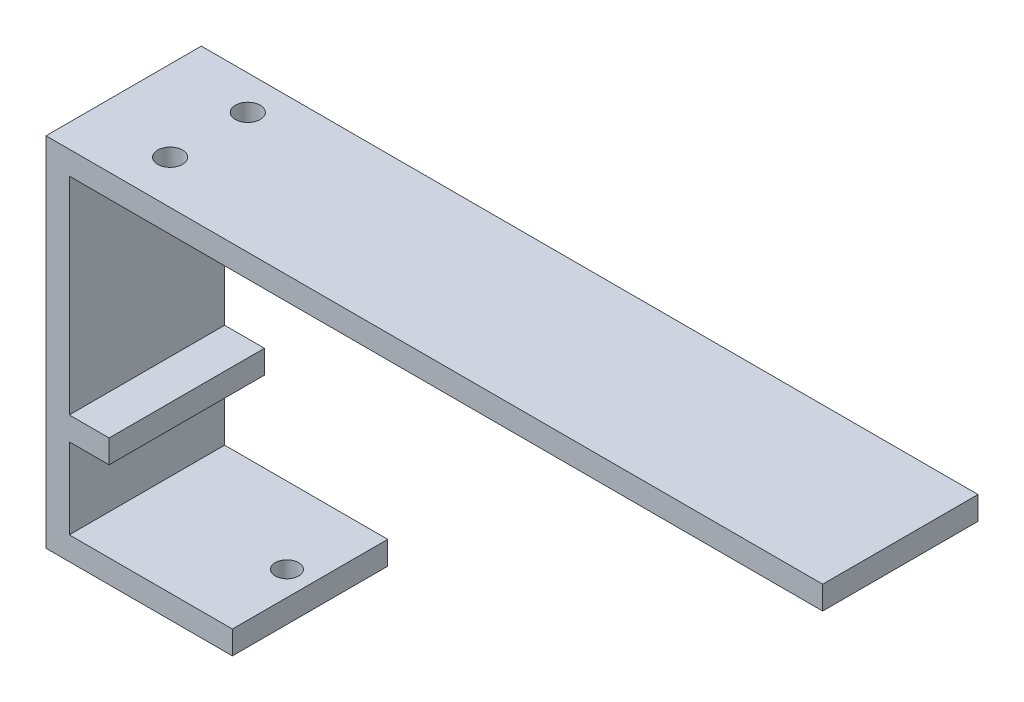
ISO-10303-21;
HEADER;
FILE_DESCRIPTION(('STEP AP214'),'2;1');
FILE_NAME('part.step','',(''),(''),'','','');
FILE_SCHEMA(('AUTOMOTIVE_DESIGN { 1 0 10303 214 1 1 1 1 }'));
ENDSEC;
DATA;
#1=APPLICATION_CONTEXT('core data for automotive mechanical design processes');
#2=APPLICATION_PROTOCOL_DEFINITION('international standard','automotive_design',2000,#1);
#3=PRODUCT_CONTEXT('',#1,'mechanical');
#4=PRODUCT('Part','Part','',(#3));
#5=PRODUCT_RELATED_PRODUCT_CATEGORY('part','',(#4));
#6=PRODUCT_DEFINITION_FORMATION('','',#4);
#7=PRODUCT_DEFINITION_CONTEXT('part definition',#1,'design');
#8=PRODUCT_DEFINITION('design','',#6,#7);
#9=PRODUCT_DEFINITION_SHAPE('','',#8);
#10=(LENGTH_UNIT() NAMED_UNIT(*) SI_UNIT(.MILLI.,.METRE.));
#11=(NAMED_UNIT(*) PLANE_ANGLE_UNIT() SI_UNIT($,.RADIAN.));
#12=(NAMED_UNIT(*) SI_UNIT($,.STERADIAN.) SOLID_ANGLE_UNIT());
#13=UNCERTAINTY_MEASURE_WITH_UNIT(LENGTH_MEASURE(1.E-05),#10,'distance_accuracy_value','');
#14=(GEOMETRIC_REPRESENTATION_CONTEXT(3) GLOBAL_UNCERTAINTY_ASSIGNED_CONTEXT((#13)) GLOBAL_UNIT_ASSIGNED_CONTEXT((#10,
#11,#12)) REPRESENTATION_CONTEXT('',''));
#15=CARTESIAN_POINT('',(0.,0.,0.));
#16=DIRECTION('',(0.,0.,1.));
#17=DIRECTION('',(1.,0.,0.));
#18=AXIS2_PLACEMENT_3D('',#15,#16,#17);
#19=CARTESIAN_POINT('',(3.,0.,0.));
#20=DIRECTION('',(1.,0.,0.));
#21=DIRECTION('',(0.,1.,0.));
#22=AXIS2_PLACEMENT_3D('',#19,#20,#21);
#23=PLANE('',#22);
#24=DIRECTION('',(0.,0.,1.));
#25=VECTOR('',#24,1.);
#26=CARTESIAN_POINT('',(3.,-26.63,0.));
#27=LINE('',#26,#25);
#28=CARTESIAN_POINT('',(3.,-26.63,-20.));
#29=VERTEX_POINT('',#28);
#30=CARTESIAN_POINT('',(3.,-26.63,0.));
#31=VERTEX_POINT('',#30);
#32=EDGE_CURVE('E11',#29,#31,#27,.T.);
#33=ORIENTED_EDGE('',*,*,#32,.F.);
#34=DIRECTION('',(0.,-1.,0.));
#35=VECTOR('',#34,1.);
#36=CARTESIAN_POINT('',(3.,0.,-20.));
#37=LINE('',#36,#35);
#38=CARTESIAN_POINT('',(3.,0.,-20.));
#39=VERTEX_POINT('',#38);
#40=EDGE_CURVE('E182',#39,#29,#37,.T.);
#41=ORIENTED_EDGE('',*,*,#40,.F.);
#42=DIRECTION('',(0.,0.,-1.));
#43=VECTOR('',#42,1.);
#44=CARTESIAN_POINT('',(3.,0.,0.));
#45=LINE('',#44,#43);
#46=CARTESIAN_POINT('',(3.,0.,0.));
#47=VERTEX_POINT('',#46);
#48=EDGE_CURVE('E181',#47,#39,#45,.T.);
#49=ORIENTED_EDGE('',*,*,#48,.F.);
#50=DIRECTION('',(0.,-1.,0.));
#51=VECTOR('',#50,1.);
#52=CARTESIAN_POINT('',(3.,0.,0.));
#53=LINE('',#52,#51);
#54=EDGE_CURVE('E53',#47,#31,#53,.T.);
#55=ORIENTED_EDGE('',*,*,#54,.T.);
#56=EDGE_LOOP('',(#33,#41,#49,#55));
#57=FACE_BOUND('',#56,.T.);
#58=ADVANCED_FACE('F37',(#57),#23,.T.);
#59=CARTESIAN_POINT('',(0.,0.,0.));
#60=DIRECTION('',(0.,-1.,0.));
#61=DIRECTION('',(0.,0.,-1.));
#62=AXIS2_PLACEMENT_3D('',#59,#60,#61);
#63=PLANE('',#62);
#64=CARTESIAN_POINT('',(10.38,0.,-5.6));
#65=DIRECTION('',(0.,-1.,0.));
#66=DIRECTION('',(0.,0.,-1.));
#67=AXIS2_PLACEMENT_3D('',#64,#65,#66);
#68=CIRCLE('',#67,1.6);
#69=CARTESIAN_POINT('',(10.38,0.,-7.2));
#70=VERTEX_POINT('',#69);
#71=EDGE_CURVE('E156',#70,#70,#68,.T.);
#72=ORIENTED_EDGE('',*,*,#71,.F.);
#73=EDGE_LOOP('',(#72));
#74=FACE_BOUND('',#73,.T.);
#75=CARTESIAN_POINT('',(10.38,0.,-15.6));
#76=DIRECTION('',(0.,-1.,0.));
#77=DIRECTION('',(0.,0.,-1.));
#78=AXIS2_PLACEMENT_3D('',#75,#76,#77);
#79=CIRCLE('',#78,1.6);
#80=CARTESIAN_POINT('',(10.38,0.,-17.2));
#81=VERTEX_POINT('',#80);
#82=EDGE_CURVE('E319',#81,#81,#79,.T.);
#83=ORIENTED_EDGE('',*,*,#82,.F.);
#84=EDGE_LOOP('',(#83));
#85=FACE_BOUND('',#84,.T.);
#86=DIRECTION('',(1.,0.,0.));
#87=VECTOR('',#86,1.);
#88=CARTESIAN_POINT('',(0.,0.,0.));
#89=LINE('',#88,#87);
#90=CARTESIAN_POINT('',(100.,0.,0.));
#91=VERTEX_POINT('',#90);
#92=EDGE_CURVE('E189',#47,#91,#89,.T.);
#93=ORIENTED_EDGE('',*,*,#92,.F.);
#94=ORIENTED_EDGE('',*,*,#48,.T.);
#95=DIRECTION('',(-1.,0.,0.));
#96=VECTOR('',#95,1.);
#97=CARTESIAN_POINT('',(0.,0.,-20.));
#98=LINE('',#97,#96);
#99=CARTESIAN_POINT('',(100.,0.,-20.));
#100=VERTEX_POINT('',#99);
#101=EDGE_CURVE('E196',#100,#39,#98,.T.);
#102=ORIENTED_EDGE('',*,*,#101,.F.);
#103=DIRECTION('',(0.,0.,-1.));
#104=VECTOR('',#103,1.);
#105=CARTESIAN_POINT('',(100.,0.,0.));
#106=LINE('',#105,#104);
#107=EDGE_CURVE('E204',#91,#100,#106,.T.);
#108=ORIENTED_EDGE('',*,*,#107,.F.);
#109=EDGE_LOOP('',(#93,#94,#102,#108));
#110=FACE_BOUND('',#109,.T.);
#111=ADVANCED_FACE('F252',(#74,#85,#110),#63,.T.);
#112=CARTESIAN_POINT('',(0.,3.,0.));
#113=DIRECTION('',(1.,0.,0.));
#114=DIRECTION('',(0.,0.,-1.));
#115=AXIS2_PLACEMENT_3D('',#112,#113,#114);
#116=PLANE('',#115);
#117=DIRECTION('',(0.,-1.,0.));
#118=VECTOR('',#117,1.);
#119=CARTESIAN_POINT('',(0.,3.,-20.));
#120=LINE('',#119,#118);
#121=CARTESIAN_POINT('',(0.,3.,-20.));
#122=VERTEX_POINT('',#121);
#123=CARTESIAN_POINT('',(0.,-43.,-20.));
#124=VERTEX_POINT('',#123);
#125=EDGE_CURVE('E202',#122,#124,#120,.T.);
#126=ORIENTED_EDGE('',*,*,#125,.T.);
#127=DIRECTION('',(0.,0.,-1.));
#128=VECTOR('',#127,1.);
#129=CARTESIAN_POINT('',(0.,-43.,0.));
#130=LINE('',#129,#128);
#131=CARTESIAN_POINT('',(0.,-43.,0.));
#132=VERTEX_POINT('',#131);
#133=EDGE_CURVE('E186',#132,#124,#130,.T.);
#134=ORIENTED_EDGE('',*,*,#133,.F.);
#135=DIRECTION('',(0.,-1.,0.));
#136=VECTOR('',#135,1.);
#137=CARTESIAN_POINT('',(0.,3.,0.));
#138=LINE('',#137,#136);
#139=CARTESIAN_POINT('',(0.,3.,0.));
#140=VERTEX_POINT('',#139);
#141=EDGE_CURVE('E215',#140,#132,#138,.T.);
#142=ORIENTED_EDGE('',*,*,#141,.F.);
#143=DIRECTION('',(0.,0.,1.));
#144=VECTOR('',#143,1.);
#145=CARTESIAN_POINT('',(0.,3.,0.));
#146=LINE('',#145,#144);
#147=EDGE_CURVE('E192',#122,#140,#146,.T.);
#148=ORIENTED_EDGE('',*,*,#147,.F.);
#149=EDGE_LOOP('',(#126,#134,#142,#148));
#150=FACE_BOUND('',#149,.T.);
#151=ADVANCED_FACE('F39',(#150),#116,.F.);
#152=CARTESIAN_POINT('',(0.,3.,0.));
#153=DIRECTION('',(0.,0.,-1.));
#154=DIRECTION('',(-1.,0.,0.));
#155=AXIS2_PLACEMENT_3D('',#152,#153,#154);
#156=PLANE('',#155);
#157=DIRECTION('',(-1.,0.,0.));
#158=VECTOR('',#157,1.);
#159=CARTESIAN_POINT('',(2.12653360182458,-26.63,0.));
#160=LINE('',#159,#158);
#161=CARTESIAN_POINT('',(8.12653360182458,-26.63,0.));
#162=VERTEX_POINT('',#161);
#163=EDGE_CURVE('E136',#162,#31,#160,.T.);
#164=ORIENTED_EDGE('',*,*,#163,.T.);
#165=ORIENTED_EDGE('',*,*,#54,.F.);
#166=ORIENTED_EDGE('',*,*,#92,.T.);
#167=DIRECTION('',(0.,-1.,0.));
#168=VECTOR('',#167,1.);
#169=CARTESIAN_POINT('',(100.,3.,0.));
#170=LINE('',#169,#168);
#171=CARTESIAN_POINT('',(100.,3.,0.));
#172=VERTEX_POINT('',#171);
#173=EDGE_CURVE('E212',#172,#91,#170,.T.);
#174=ORIENTED_EDGE('',*,*,#173,.F.);
#175=DIRECTION('',(1.,0.,0.));
#176=VECTOR('',#175,1.);
#177=CARTESIAN_POINT('',(0.,3.,0.));
#178=LINE('',#177,#176);
#179=EDGE_CURVE('E195',#140,#172,#178,.T.);
#180=ORIENTED_EDGE('',*,*,#179,.F.);
#181=ORIENTED_EDGE('',*,*,#141,.T.);
#182=DIRECTION('',(1.,0.,0.));
#183=VECTOR('',#182,1.);
#184=CARTESIAN_POINT('',(0.,-43.,0.));
#185=LINE('',#184,#183);
#186=CARTESIAN_POINT('',(24.,-43.,0.));
#187=VERTEX_POINT('',#186);
#188=EDGE_CURVE('E178',#132,#187,#185,.T.);
#189=ORIENTED_EDGE('',*,*,#188,.T.);
#190=DIRECTION('',(0.,-1.,0.));
#191=VECTOR('',#190,1.);
#192=CARTESIAN_POINT('',(24.,-40.,0.));
#193=LINE('',#192,#191);
#194=CARTESIAN_POINT('',(24.,-40.,0.));
#195=VERTEX_POINT('',#194);
#196=EDGE_CURVE('E162',#195,#187,#193,.T.);
#197=ORIENTED_EDGE('',*,*,#196,.F.);
#198=DIRECTION('',(1.,0.,0.));
#199=VECTOR('',#198,1.);
#200=CARTESIAN_POINT('',(24.,-40.,0.));
#201=LINE('',#200,#199);
#202=CARTESIAN_POINT('',(3.,-40.,0.));
#203=VERTEX_POINT('',#202);
#204=EDGE_CURVE('E165',#203,#195,#201,.T.);
#205=ORIENTED_EDGE('',*,*,#204,.F.);
#206=CARTESIAN_POINT('',(3.,-29.63,0.));
#207=VERTEX_POINT('',#206);
#208=EDGE_CURVE('E179',#207,#203,#53,.T.);
#209=ORIENTED_EDGE('',*,*,#208,.F.);
#210=DIRECTION('',(1.,0.,0.));
#211=VECTOR('',#210,1.);
#212=CARTESIAN_POINT('',(2.12653360182458,-29.63,0.));
#213=LINE('',#212,#211);
#214=CARTESIAN_POINT('',(8.12653360182458,-29.63,0.));
#215=VERTEX_POINT('',#214);
#216=EDGE_CURVE('E154',#207,#215,#213,.T.);
#217=ORIENTED_EDGE('',*,*,#216,.T.);
#218=DIRECTION('',(0.,1.,0.));
#219=VECTOR('',#218,1.);
#220=CARTESIAN_POINT('',(8.12653360182458,-29.63,0.));
#221=LINE('',#220,#219);
#222=EDGE_CURVE('E143',#215,#162,#221,.T.);
#223=ORIENTED_EDGE('',*,*,#222,.T.);
#224=EDGE_LOOP('',(#164,#165,#166,#174,#180,#181,#189,#197,#205,#209,#217,#223));
#225=FACE_BOUND('',#224,.T.);
#226=ADVANCED_FACE('F227',(#225),#156,.F.);
#227=CARTESIAN_POINT('',(100.,3.,0.));
#228=DIRECTION('',(-1.,0.,0.));
#229=DIRECTION('',(0.,0.,1.));
#230=AXIS2_PLACEMENT_3D('',#227,#228,#229);
#231=PLANE('',#230);
#232=ORIENTED_EDGE('',*,*,#107,.T.);
#233=DIRECTION('',(0.,-1.,0.));
#234=VECTOR('',#233,1.);
#235=CARTESIAN_POINT('',(100.,3.,-20.));
#236=LINE('',#235,#234);
#237=CARTESIAN_POINT('',(100.,3.,-20.));
#238=VERTEX_POINT('',#237);
#239=EDGE_CURVE('E209',#238,#100,#236,.T.);
#240=ORIENTED_EDGE('',*,*,#239,.F.);
#241=DIRECTION('',(0.,0.,-1.));
#242=VECTOR('',#241,1.);
#243=CARTESIAN_POINT('',(100.,3.,0.));
#244=LINE('',#243,#242);
#245=EDGE_CURVE('E198',#172,#238,#244,.T.);
#246=ORIENTED_EDGE('',*,*,#245,.F.);
#247=ORIENTED_EDGE('',*,*,#173,.T.);
#248=EDGE_LOOP('',(#232,#240,#246,#247));
#249=FACE_BOUND('',#248,.T.);
#250=ADVANCED_FACE('F383',(#249),#231,.F.);
#251=CARTESIAN_POINT('',(0.,3.,-20.));
#252=DIRECTION('',(0.,0.,1.));
#253=DIRECTION('',(1.,0.,0.));
#254=AXIS2_PLACEMENT_3D('',#251,#252,#253);
#255=PLANE('',#254);
#256=ORIENTED_EDGE('',*,*,#40,.T.);
#257=DIRECTION('',(-1.,0.,0.));
#258=VECTOR('',#257,1.);
#259=CARTESIAN_POINT('',(2.12653360182458,-26.63,-20.));
#260=LINE('',#259,#258);
#261=CARTESIAN_POINT('',(8.12653360182458,-26.63,-20.));
#262=VERTEX_POINT('',#261);
#263=EDGE_CURVE('E145',#262,#29,#260,.T.);
#264=ORIENTED_EDGE('',*,*,#263,.F.);
#265=DIRECTION('',(0.,1.,0.));
#266=VECTOR('',#265,1.);
#267=CARTESIAN_POINT('',(8.12653360182458,-29.63,-20.));
#268=LINE('',#267,#266);
#269=CARTESIAN_POINT('',(8.12653360182458,-29.63,-20.));
#270=VERTEX_POINT('',#269);
#271=EDGE_CURVE('E135',#270,#262,#268,.T.);
#272=ORIENTED_EDGE('',*,*,#271,.F.);
#273=DIRECTION('',(1.,0.,0.));
#274=VECTOR('',#273,1.);
#275=CARTESIAN_POINT('',(2.12653360182458,-29.63,-20.));
#276=LINE('',#275,#274);
#277=CARTESIAN_POINT('',(3.,-29.63,-20.));
#278=VERTEX_POINT('',#277);
#279=EDGE_CURVE('E127',#278,#270,#276,.T.);
#280=ORIENTED_EDGE('',*,*,#279,.F.);
#281=CARTESIAN_POINT('',(3.,-40.,-20.));
#282=VERTEX_POINT('',#281);
#283=EDGE_CURVE('E60',#278,#282,#37,.T.);
#284=ORIENTED_EDGE('',*,*,#283,.T.);
#285=DIRECTION('',(1.,0.,0.));
#286=VECTOR('',#285,1.);
#287=CARTESIAN_POINT('',(24.,-40.,-20.));
#288=LINE('',#287,#286);
#289=CARTESIAN_POINT('',(24.,-40.,-20.));
#290=VERTEX_POINT('',#289);
#291=EDGE_CURVE('E166',#282,#290,#288,.T.);
#292=ORIENTED_EDGE('',*,*,#291,.T.);
#293=DIRECTION('',(0.,-1.,0.));
#294=VECTOR('',#293,1.);
#295=CARTESIAN_POINT('',(24.,-40.,-20.));
#296=LINE('',#295,#294);
#297=CARTESIAN_POINT('',(24.,-43.,-20.));
#298=VERTEX_POINT('',#297);
#299=EDGE_CURVE('E160',#290,#298,#296,.T.);
#300=ORIENTED_EDGE('',*,*,#299,.T.);
#301=DIRECTION('',(1.,0.,0.));
#302=VECTOR('',#301,1.);
#303=CARTESIAN_POINT('',(0.,-43.,-20.));
#304=LINE('',#303,#302);
#305=EDGE_CURVE('E184',#124,#298,#304,.T.);
#306=ORIENTED_EDGE('',*,*,#305,.F.);
#307=ORIENTED_EDGE('',*,*,#125,.F.);
#308=DIRECTION('',(-1.,0.,0.));
#309=VECTOR('',#308,1.);
#310=CARTESIAN_POINT('',(0.,3.,-20.));
#311=LINE('',#310,#309);
#312=EDGE_CURVE('E200',#238,#122,#311,.T.);
#313=ORIENTED_EDGE('',*,*,#312,.F.);
#314=ORIENTED_EDGE('',*,*,#239,.T.);
#315=ORIENTED_EDGE('',*,*,#101,.T.);
#316=EDGE_LOOP('',(#256,#264,#272,#280,#284,#292,#300,#306,#307,#313,#314,#315));
#317=FACE_BOUND('',#316,.T.);
#318=ADVANCED_FACE('F148',(#317),#255,.F.);
#319=CARTESIAN_POINT('',(0.,3.,0.));
#320=DIRECTION('',(0.,-1.,0.));
#321=DIRECTION('',(0.,0.,-1.));
#322=AXIS2_PLACEMENT_3D('',#319,#320,#321);
#323=PLANE('',#322);
#324=CARTESIAN_POINT('',(10.38,3.,-5.6));
#325=DIRECTION('',(0.,-1.,0.));
#326=DIRECTION('',(0.,0.,-1.));
#327=AXIS2_PLACEMENT_3D('',#324,#325,#326);
#328=CIRCLE('',#327,1.6);
#329=CARTESIAN_POINT('',(10.38,3.,-7.2));
#330=VERTEX_POINT('',#329);
#331=EDGE_CURVE('E321',#330,#330,#328,.T.);
#332=ORIENTED_EDGE('',*,*,#331,.T.);
#333=EDGE_LOOP('',(#332));
#334=FACE_BOUND('',#333,.T.);
#335=CARTESIAN_POINT('',(10.38,3.,-15.6));
#336=DIRECTION('',(0.,-1.,0.));
#337=DIRECTION('',(0.,0.,-1.));
#338=AXIS2_PLACEMENT_3D('',#335,#336,#337);
#339=CIRCLE('',#338,1.6);
#340=CARTESIAN_POINT('',(10.38,3.,-17.2));
#341=VERTEX_POINT('',#340);
#342=EDGE_CURVE('E315',#341,#341,#339,.T.);
#343=ORIENTED_EDGE('',*,*,#342,.T.);
#344=EDGE_LOOP('',(#343));
#345=FACE_BOUND('',#344,.T.);
#346=ORIENTED_EDGE('',*,*,#147,.T.);
#347=ORIENTED_EDGE('',*,*,#179,.T.);
#348=ORIENTED_EDGE('',*,*,#245,.T.);
#349=ORIENTED_EDGE('',*,*,#312,.T.);
#350=EDGE_LOOP('',(#346,#347,#348,#349));
#351=FACE_BOUND('',#350,.T.);
#352=ADVANCED_FACE('F243',(#334,#345,#351),#323,.F.);
#353=CARTESIAN_POINT('',(0.,-43.,0.));
#354=DIRECTION('',(0.,1.,0.));
#355=DIRECTION('',(0.,0.,1.));
#356=AXIS2_PLACEMENT_3D('',#353,#354,#355);
#357=PLANE('',#356);
#358=CARTESIAN_POINT('',(20.8526805311293,-43.,-10.1658488454481));
#359=DIRECTION('',(0.,-1.,0.));
#360=DIRECTION('',(0.,0.,-1.));
#361=AXIS2_PLACEMENT_3D('',#358,#359,#360);
#362=CIRCLE('',#361,1.5);
#363=CARTESIAN_POINT('',(20.8526805311293,-43.,-11.6658488454481));
#364=VERTEX_POINT('',#363);
#365=EDGE_CURVE('E313',#364,#364,#362,.T.);
#366=ORIENTED_EDGE('',*,*,#365,.F.);
#367=EDGE_LOOP('',(#366));
#368=FACE_BOUND('',#367,.T.);
#369=ORIENTED_EDGE('',*,*,#305,.T.);
#370=DIRECTION('',(0.,0.,-1.));
#371=VECTOR('',#370,1.);
#372=CARTESIAN_POINT('',(24.,-43.,0.));
#373=LINE('',#372,#371);
#374=EDGE_CURVE('E168',#187,#298,#373,.T.);
#375=ORIENTED_EDGE('',*,*,#374,.F.);
#376=ORIENTED_EDGE('',*,*,#188,.F.);
#377=ORIENTED_EDGE('',*,*,#133,.T.);
#378=EDGE_LOOP('',(#369,#375,#376,#377));
#379=FACE_BOUND('',#378,.T.);
#380=ADVANCED_FACE('F238',(#368,#379),#357,.F.);
#381=DIRECTION('',(0.,0.,-1.));
#382=VECTOR('',#381,1.);
#383=CARTESIAN_POINT('',(3.,-29.63,0.));
#384=LINE('',#383,#382);
#385=EDGE_CURVE('E46',#207,#278,#384,.T.);
#386=ORIENTED_EDGE('',*,*,#385,.F.);
#387=ORIENTED_EDGE('',*,*,#208,.T.);
#388=DIRECTION('',(0.,0.,1.));
#389=VECTOR('',#388,1.);
#390=CARTESIAN_POINT('',(3.,-40.,0.));
#391=LINE('',#390,#389);
#392=EDGE_CURVE('E217',#282,#203,#391,.T.);
#393=ORIENTED_EDGE('',*,*,#392,.F.);
#394=ORIENTED_EDGE('',*,*,#283,.F.);
#395=EDGE_LOOP('',(#386,#387,#393,#394));
#396=FACE_BOUND('',#395,.T.);
#397=ADVANCED_FACE('F268',(#396),#23,.T.);
#398=CARTESIAN_POINT('',(24.,-40.,0.));
#399=DIRECTION('',(1.,0.,0.));
#400=DIRECTION('',(0.,1.,0.));
#401=AXIS2_PLACEMENT_3D('',#398,#399,#400);
#402=PLANE('',#401);
#403=ORIENTED_EDGE('',*,*,#299,.F.);
#404=DIRECTION('',(0.,0.,-1.));
#405=VECTOR('',#404,1.);
#406=CARTESIAN_POINT('',(24.,-40.,0.));
#407=LINE('',#406,#405);
#408=EDGE_CURVE('E172',#195,#290,#407,.T.);
#409=ORIENTED_EDGE('',*,*,#408,.F.);
#410=ORIENTED_EDGE('',*,*,#196,.T.);
#411=ORIENTED_EDGE('',*,*,#374,.T.);
#412=EDGE_LOOP('',(#403,#409,#410,#411));
#413=FACE_BOUND('',#412,.T.);
#414=ADVANCED_FACE('F232',(#413),#402,.T.);
#415=CARTESIAN_POINT('',(24.,-40.,0.));
#416=DIRECTION('',(0.,1.,0.));
#417=DIRECTION('',(0.,0.,1.));
#418=AXIS2_PLACEMENT_3D('',#415,#416,#417);
#419=PLANE('',#418);
#420=CARTESIAN_POINT('',(20.8526805311293,-40.,-10.1658488454481));
#421=DIRECTION('',(0.,1.,0.));
#422=DIRECTION('',(0.,0.,1.));
#423=AXIS2_PLACEMENT_3D('',#420,#421,#422);
#424=CIRCLE('',#423,1.5);
#425=CARTESIAN_POINT('',(20.8526805311293,-40.,-8.66584884544806));
#426=VERTEX_POINT('',#425);
#427=EDGE_CURVE('E41',#426,#426,#424,.T.);
#428=ORIENTED_EDGE('',*,*,#427,.F.);
#429=EDGE_LOOP('',(#428));
#430=FACE_BOUND('',#429,.T.);
#431=ORIENTED_EDGE('',*,*,#291,.F.);
#432=ORIENTED_EDGE('',*,*,#392,.T.);
#433=ORIENTED_EDGE('',*,*,#204,.T.);
#434=ORIENTED_EDGE('',*,*,#408,.T.);
#435=EDGE_LOOP('',(#431,#432,#433,#434));
#436=FACE_BOUND('',#435,.T.);
#437=ADVANCED_FACE('F223',(#430,#436),#419,.T.);
#438=CARTESIAN_POINT('',(2.12653360182458,-26.63,-20.));
#439=DIRECTION('',(0.,1.,0.));
#440=DIRECTION('',(0.,0.,1.));
#441=AXIS2_PLACEMENT_3D('',#438,#439,#440);
#442=PLANE('',#441);
#443=ORIENTED_EDGE('',*,*,#263,.T.);
#444=ORIENTED_EDGE('',*,*,#32,.T.);
#445=ORIENTED_EDGE('',*,*,#163,.F.);
#446=DIRECTION('',(0.,0.,1.));
#447=VECTOR('',#446,1.);
#448=CARTESIAN_POINT('',(8.12653360182458,-26.63,-20.));
#449=LINE('',#448,#447);
#450=EDGE_CURVE('E144',#262,#162,#449,.T.);
#451=ORIENTED_EDGE('',*,*,#450,.F.);
#452=EDGE_LOOP('',(#443,#444,#445,#451));
#453=FACE_BOUND('',#452,.T.);
#454=ADVANCED_FACE('F255',(#453),#442,.T.);
#455=CARTESIAN_POINT('',(8.12653360182458,-29.63,-20.));
#456=DIRECTION('',(1.,0.,0.));
#457=DIRECTION('',(0.,0.,-1.));
#458=AXIS2_PLACEMENT_3D('',#455,#456,#457);
#459=PLANE('',#458);
#460=ORIENTED_EDGE('',*,*,#222,.F.);
#461=DIRECTION('',(0.,0.,1.));
#462=VECTOR('',#461,1.);
#463=CARTESIAN_POINT('',(8.12653360182458,-29.63,-20.));
#464=LINE('',#463,#462);
#465=EDGE_CURVE('E131',#270,#215,#464,.T.);
#466=ORIENTED_EDGE('',*,*,#465,.F.);
#467=ORIENTED_EDGE('',*,*,#271,.T.);
#468=ORIENTED_EDGE('',*,*,#450,.T.);
#469=EDGE_LOOP('',(#460,#466,#467,#468));
#470=FACE_BOUND('',#469,.T.);
#471=ADVANCED_FACE('F140',(#470),#459,.T.);
#472=CARTESIAN_POINT('',(2.12653360182458,-29.63,-20.));
#473=DIRECTION('',(0.,-1.,0.));
#474=DIRECTION('',(0.,0.,-1.));
#475=AXIS2_PLACEMENT_3D('',#472,#473,#474);
#476=PLANE('',#475);
#477=ORIENTED_EDGE('',*,*,#216,.F.);
#478=ORIENTED_EDGE('',*,*,#385,.T.);
#479=ORIENTED_EDGE('',*,*,#279,.T.);
#480=ORIENTED_EDGE('',*,*,#465,.T.);
#481=EDGE_LOOP('',(#477,#478,#479,#480));
#482=FACE_BOUND('',#481,.T.);
#483=ADVANCED_FACE('F130',(#482),#476,.T.);
#484=CARTESIAN_POINT('',(10.38,37.,-15.6));
#485=DIRECTION('',(0.,-1.,0.));
#486=DIRECTION('',(0.,0.,-1.));
#487=AXIS2_PLACEMENT_3D('',#484,#485,#486);
#488=CYLINDRICAL_SURFACE('',#487,1.6);
#489=ORIENTED_EDGE('',*,*,#82,.T.);
#490=EDGE_LOOP('',(#489));
#491=FACE_BOUND('',#490,.T.);
#492=ORIENTED_EDGE('',*,*,#342,.F.);
#493=EDGE_LOOP('',(#492));
#494=FACE_BOUND('',#493,.T.);
#495=ADVANCED_FACE('F290',(#491,#494),#488,.F.);
#496=CARTESIAN_POINT('',(10.38,37.,-5.6));
#497=DIRECTION('',(0.,-1.,0.));
#498=DIRECTION('',(0.,0.,-1.));
#499=AXIS2_PLACEMENT_3D('',#496,#497,#498);
#500=CYLINDRICAL_SURFACE('',#499,1.6);
#501=ORIENTED_EDGE('',*,*,#71,.T.);
#502=EDGE_LOOP('',(#501));
#503=FACE_BOUND('',#502,.T.);
#504=ORIENTED_EDGE('',*,*,#331,.F.);
#505=EDGE_LOOP('',(#504));
#506=FACE_BOUND('',#505,.T.);
#507=ADVANCED_FACE('F294',(#503,#506),#500,.F.);
#508=CARTESIAN_POINT('',(20.8526805311293,-23.,-10.1658488454481));
#509=DIRECTION('',(0.,-1.,0.));
#510=DIRECTION('',(0.,0.,-1.));
#511=AXIS2_PLACEMENT_3D('',#508,#509,#510);
#512=CYLINDRICAL_SURFACE('',#511,1.5);
#513=ORIENTED_EDGE('',*,*,#427,.T.);
#514=EDGE_LOOP('',(#513));
#515=FACE_BOUND('',#514,.T.);
#516=ORIENTED_EDGE('',*,*,#365,.T.);
#517=EDGE_LOOP('',(#516));
#518=FACE_BOUND('',#517,.T.);
#519=ADVANCED_FACE('F299',(#515,#518),#512,.F.);
#520=CLOSED_SHELL('',(#58,#111,#151,#226,#250,#318,#352,#380,#397,#414,#437,#454,#471,#483,#495,
#507,#519));
#521=MANIFOLD_SOLID_BREP('B2',#520);
#522=ADVANCED_BREP_SHAPE_REPRESENTATION('',(#18,#521),#14);
#523=SHAPE_DEFINITION_REPRESENTATION(#9,#522);
ENDSEC;
END-ISO-10303-21;
